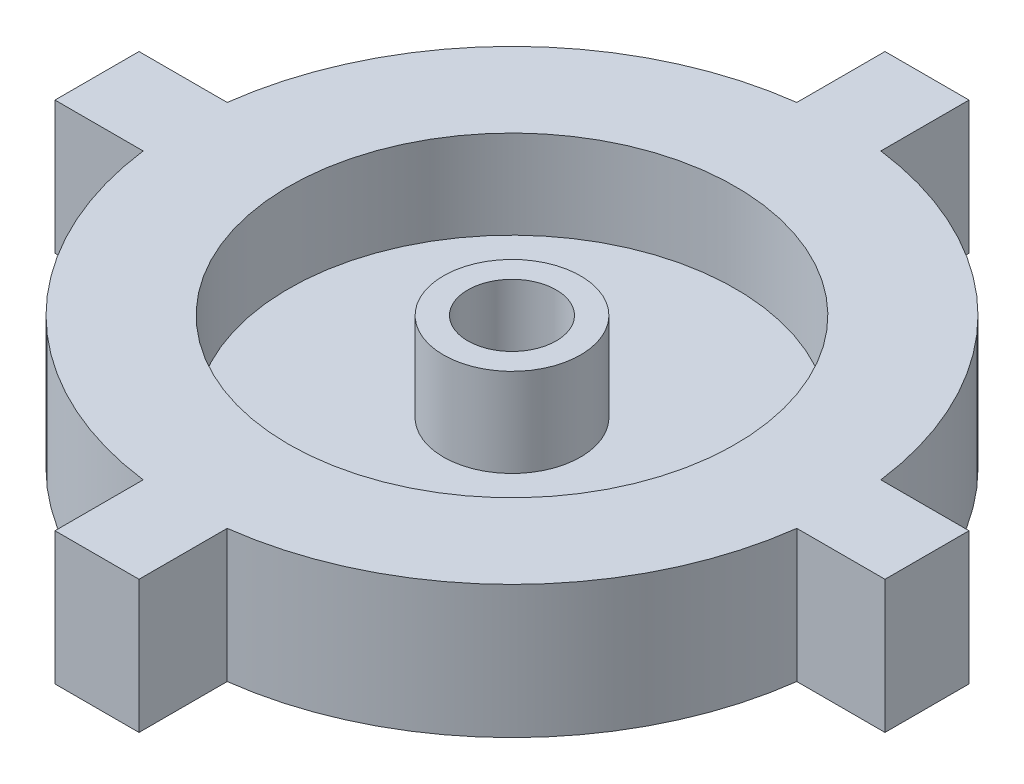
ISO-10303-21;
HEADER;
FILE_DESCRIPTION(('STEP AP214'),'2;1');
FILE_NAME('part.step','',(''),(''),'','','');
FILE_SCHEMA(('AUTOMOTIVE_DESIGN { 1 0 10303 214 1 1 1 1 }'));
ENDSEC;
DATA;
#1=APPLICATION_CONTEXT('core data for automotive mechanical design processes');
#2=APPLICATION_PROTOCOL_DEFINITION('international standard','automotive_design',2000,#1);
#3=PRODUCT_CONTEXT('',#1,'mechanical');
#4=PRODUCT('Part','Part','',(#3));
#5=PRODUCT_RELATED_PRODUCT_CATEGORY('part','',(#4));
#6=PRODUCT_DEFINITION_FORMATION('','',#4);
#7=PRODUCT_DEFINITION_CONTEXT('part definition',#1,'design');
#8=PRODUCT_DEFINITION('design','',#6,#7);
#9=PRODUCT_DEFINITION_SHAPE('','',#8);
#10=(LENGTH_UNIT() NAMED_UNIT(*) SI_UNIT(.MILLI.,.METRE.));
#11=(NAMED_UNIT(*) PLANE_ANGLE_UNIT() SI_UNIT($,.RADIAN.));
#12=(NAMED_UNIT(*) SI_UNIT($,.STERADIAN.) SOLID_ANGLE_UNIT());
#13=UNCERTAINTY_MEASURE_WITH_UNIT(LENGTH_MEASURE(1.E-05),#10,'distance_accuracy_value','');
#14=(GEOMETRIC_REPRESENTATION_CONTEXT(3) GLOBAL_UNCERTAINTY_ASSIGNED_CONTEXT((#13)) GLOBAL_UNIT_ASSIGNED_CONTEXT((#10,
#11,#12)) REPRESENTATION_CONTEXT('',''));
#15=CARTESIAN_POINT('',(0.,0.,0.));
#16=DIRECTION('',(0.,0.,1.));
#17=DIRECTION('',(1.,0.,0.));
#18=AXIS2_PLACEMENT_3D('',#15,#16,#17);
#19=CARTESIAN_POINT('',(0.,7.5,0.));
#20=DIRECTION('',(0.,1.,0.));
#21=DIRECTION('',(0.,0.,1.));
#22=AXIS2_PLACEMENT_3D('',#19,#20,#21);
#23=PLANE('',#22);
#24=CARTESIAN_POINT('',(0.,7.5,0.));
#25=DIRECTION('',(0.,1.,0.));
#26=DIRECTION('',(0.,0.,1.));
#27=AXIS2_PLACEMENT_3D('',#24,#25,#26);
#28=CIRCLE('',#27,25.25);
#29=CARTESIAN_POINT('',(0.,7.5,25.25));
#30=VERTEX_POINT('',#29);
#31=EDGE_CURVE('E361',#30,#30,#28,.T.);
#32=ORIENTED_EDGE('',*,*,#31,.F.);
#33=EDGE_LOOP('',(#32));
#34=FACE_BOUND('',#33,.T.);
#35=DIRECTION('',(0.,0.,1.));
#36=VECTOR('',#35,1.);
#37=CARTESIAN_POINT('',(-4.75,7.5,0.));
#38=LINE('',#37,#36);
#39=CARTESIAN_POINT('',(-4.75,7.5,-46.9151718682963));
#40=VERTEX_POINT('',#39);
#41=CARTESIAN_POINT('',(-4.75,7.5,-36.9459064038223));
#42=VERTEX_POINT('',#41);
#43=EDGE_CURVE('E156',#40,#42,#38,.T.);
#44=ORIENTED_EDGE('',*,*,#43,.T.);
#45=CARTESIAN_POINT('',(0.,7.5,0.));
#46=DIRECTION('',(0.,1.,0.));
#47=DIRECTION('',(0.,0.,1.));
#48=AXIS2_PLACEMENT_3D('',#45,#46,#47);
#49=CIRCLE('',#48,37.25);
#50=CARTESIAN_POINT('',(-36.9459064038223,7.5,-4.74999999999999));
#51=VERTEX_POINT('',#50);
#52=EDGE_CURVE('E36',#42,#51,#49,.T.);
#53=ORIENTED_EDGE('',*,*,#52,.T.);
#54=DIRECTION('',(-1.,0.,0.));
#55=VECTOR('',#54,1.);
#56=CARTESIAN_POINT('',(0.,7.5,-4.75));
#57=LINE('',#56,#55);
#58=CARTESIAN_POINT('',(-46.9151718682963,7.5,-4.74999999999999));
#59=VERTEX_POINT('',#58);
#60=EDGE_CURVE('E145',#51,#59,#57,.T.);
#61=ORIENTED_EDGE('',*,*,#60,.T.);
#62=DIRECTION('',(0.,0.,1.));
#63=VECTOR('',#62,1.);
#64=CARTESIAN_POINT('',(-46.9151718682963,7.5,0.));
#65=LINE('',#64,#63);
#66=CARTESIAN_POINT('',(-46.9151718682963,7.5,4.75000000000001));
#67=VERTEX_POINT('',#66);
#68=EDGE_CURVE('E150',#59,#67,#65,.T.);
#69=ORIENTED_EDGE('',*,*,#68,.T.);
#70=DIRECTION('',(1.,0.,0.));
#71=VECTOR('',#70,1.);
#72=CARTESIAN_POINT('',(0.,7.5,4.75));
#73=LINE('',#72,#71);
#74=CARTESIAN_POINT('',(-36.9459064038223,7.5,4.75000000000001));
#75=VERTEX_POINT('',#74);
#76=EDGE_CURVE('E189',#67,#75,#73,.T.);
#77=ORIENTED_EDGE('',*,*,#76,.T.);
#78=CARTESIAN_POINT('',(0.,7.5,0.));
#79=DIRECTION('',(0.,1.,0.));
#80=DIRECTION('',(0.,0.,1.));
#81=AXIS2_PLACEMENT_3D('',#78,#79,#80);
#82=CIRCLE('',#81,37.25);
#83=CARTESIAN_POINT('',(-4.75,7.5,36.9459064038223));
#84=VERTEX_POINT('',#83);
#85=EDGE_CURVE('E188',#75,#84,#82,.T.);
#86=ORIENTED_EDGE('',*,*,#85,.T.);
#87=DIRECTION('',(0.,0.,1.));
#88=VECTOR('',#87,1.);
#89=CARTESIAN_POINT('',(-4.75,7.5,0.));
#90=LINE('',#89,#88);
#91=CARTESIAN_POINT('',(-4.74999999999999,7.5,46.9151718682963));
#92=VERTEX_POINT('',#91);
#93=EDGE_CURVE('E185',#84,#92,#90,.T.);
#94=ORIENTED_EDGE('',*,*,#93,.T.);
#95=DIRECTION('',(1.,0.,0.));
#96=VECTOR('',#95,1.);
#97=CARTESIAN_POINT('',(0.,7.5,46.9151718682963));
#98=LINE('',#97,#96);
#99=CARTESIAN_POINT('',(4.75000000000001,7.5,46.9151718682963));
#100=VERTEX_POINT('',#99);
#101=EDGE_CURVE('E182',#92,#100,#98,.T.);
#102=ORIENTED_EDGE('',*,*,#101,.T.);
#103=DIRECTION('',(0.,0.,-1.));
#104=VECTOR('',#103,1.);
#105=CARTESIAN_POINT('',(4.75,7.5,0.));
#106=LINE('',#105,#104);
#107=CARTESIAN_POINT('',(4.75,7.5,36.9459064038223));
#108=VERTEX_POINT('',#107);
#109=EDGE_CURVE('E179',#100,#108,#106,.T.);
#110=ORIENTED_EDGE('',*,*,#109,.T.);
#111=CARTESIAN_POINT('',(0.,7.5,0.));
#112=DIRECTION('',(0.,1.,0.));
#113=DIRECTION('',(0.,0.,1.));
#114=AXIS2_PLACEMENT_3D('',#111,#112,#113);
#115=CIRCLE('',#114,37.25);
#116=CARTESIAN_POINT('',(36.9459064038223,7.5,4.75));
#117=VERTEX_POINT('',#116);
#118=EDGE_CURVE('E178',#108,#117,#115,.T.);
#119=ORIENTED_EDGE('',*,*,#118,.T.);
#120=DIRECTION('',(1.,0.,0.));
#121=VECTOR('',#120,1.);
#122=CARTESIAN_POINT('',(0.,7.5,4.75));
#123=LINE('',#122,#121);
#124=CARTESIAN_POINT('',(46.9151718682963,7.5,4.75));
#125=VERTEX_POINT('',#124);
#126=EDGE_CURVE('E175',#117,#125,#123,.T.);
#127=ORIENTED_EDGE('',*,*,#126,.T.);
#128=DIRECTION('',(0.,0.,-1.));
#129=VECTOR('',#128,1.);
#130=CARTESIAN_POINT('',(46.9151718682963,7.5,0.));
#131=LINE('',#130,#129);
#132=CARTESIAN_POINT('',(46.9151718682963,7.5,-4.75));
#133=VERTEX_POINT('',#132);
#134=EDGE_CURVE('E172',#125,#133,#131,.T.);
#135=ORIENTED_EDGE('',*,*,#134,.T.);
#136=DIRECTION('',(-1.,0.,0.));
#137=VECTOR('',#136,1.);
#138=CARTESIAN_POINT('',(0.,7.5,-4.75));
#139=LINE('',#138,#137);
#140=CARTESIAN_POINT('',(36.9459064038223,7.5,-4.75));
#141=VERTEX_POINT('',#140);
#142=EDGE_CURVE('E169',#133,#141,#139,.T.);
#143=ORIENTED_EDGE('',*,*,#142,.T.);
#144=CARTESIAN_POINT('',(0.,7.5,0.));
#145=DIRECTION('',(0.,1.,0.));
#146=DIRECTION('',(0.,0.,1.));
#147=AXIS2_PLACEMENT_3D('',#144,#145,#146);
#148=CIRCLE('',#147,37.25);
#149=CARTESIAN_POINT('',(4.75,7.5,-36.9459064038223));
#150=VERTEX_POINT('',#149);
#151=EDGE_CURVE('E168',#141,#150,#148,.T.);
#152=ORIENTED_EDGE('',*,*,#151,.T.);
#153=DIRECTION('',(0.,0.,-1.));
#154=VECTOR('',#153,1.);
#155=CARTESIAN_POINT('',(4.75,7.5,0.));
#156=LINE('',#155,#154);
#157=CARTESIAN_POINT('',(4.75,7.5,-46.9151718682963));
#158=VERTEX_POINT('',#157);
#159=EDGE_CURVE('E165',#150,#158,#156,.T.);
#160=ORIENTED_EDGE('',*,*,#159,.T.);
#161=DIRECTION('',(-1.,0.,0.));
#162=VECTOR('',#161,1.);
#163=CARTESIAN_POINT('',(0.,7.5,-46.9151718682963));
#164=LINE('',#163,#162);
#165=EDGE_CURVE('E162',#158,#40,#164,.T.);
#166=ORIENTED_EDGE('',*,*,#165,.T.);
#167=EDGE_LOOP('',(#44,#53,#61,#69,#77,#86,#94,#102,#110,#119,#127,#135,#143,#152,#160,#166));
#168=FACE_BOUND('',#167,.T.);
#169=ADVANCED_FACE('F32',(#34,#168),#23,.T.);
#170=CARTESIAN_POINT('',(0.,-7.5,0.));
#171=DIRECTION('',(0.,1.,0.));
#172=DIRECTION('',(0.,0.,1.));
#173=AXIS2_PLACEMENT_3D('',#170,#171,#172);
#174=PLANE('',#173);
#175=CARTESIAN_POINT('',(0.,-7.5,0.));
#176=DIRECTION('',(0.,1.,0.));
#177=DIRECTION('',(0.,0.,1.));
#178=AXIS2_PLACEMENT_3D('',#175,#176,#177);
#179=CIRCLE('',#178,5.);
#180=CARTESIAN_POINT('',(0.,-7.5,5.));
#181=VERTEX_POINT('',#180);
#182=EDGE_CURVE('E164',#181,#181,#179,.T.);
#183=ORIENTED_EDGE('',*,*,#182,.T.);
#184=EDGE_LOOP('',(#183));
#185=FACE_BOUND('',#184,.T.);
#186=CARTESIAN_POINT('',(0.,-7.5,0.));
#187=DIRECTION('',(0.,1.,0.));
#188=DIRECTION('',(1.,0.,0.));
#189=AXIS2_PLACEMENT_3D('',#186,#187,#188);
#190=CIRCLE('',#189,37.25);
#191=CARTESIAN_POINT('',(-4.75,-7.5,-36.9459064038223));
#192=VERTEX_POINT('',#191);
#193=CARTESIAN_POINT('',(-36.9459064038223,-7.5,-4.74999999999999));
#194=VERTEX_POINT('',#193);
#195=EDGE_CURVE('E42',#192,#194,#190,.T.);
#196=ORIENTED_EDGE('',*,*,#195,.F.);
#197=DIRECTION('',(0.,0.,1.));
#198=VECTOR('',#197,1.);
#199=CARTESIAN_POINT('',(-4.75,-7.5,-37.1651718682963));
#200=LINE('',#199,#198);
#201=CARTESIAN_POINT('',(-4.75,-7.5,-46.9151718682963));
#202=VERTEX_POINT('',#201);
#203=EDGE_CURVE('E195',#202,#192,#200,.T.);
#204=ORIENTED_EDGE('',*,*,#203,.F.);
#205=DIRECTION('',(-1.,0.,0.));
#206=VECTOR('',#205,1.);
#207=CARTESIAN_POINT('',(-5.,-7.5,-46.9151718682963));
#208=LINE('',#207,#206);
#209=CARTESIAN_POINT('',(4.75,-7.5,-46.9151718682963));
#210=VERTEX_POINT('',#209);
#211=EDGE_CURVE('E246',#210,#202,#208,.T.);
#212=ORIENTED_EDGE('',*,*,#211,.F.);
#213=DIRECTION('',(0.,0.,-1.));
#214=VECTOR('',#213,1.);
#215=CARTESIAN_POINT('',(4.75,-7.5,-47.1651718682963));
#216=LINE('',#215,#214);
#217=CARTESIAN_POINT('',(4.75,-7.5,-36.9459064038223));
#218=VERTEX_POINT('',#217);
#219=EDGE_CURVE('E199',#218,#210,#216,.T.);
#220=ORIENTED_EDGE('',*,*,#219,.F.);
#221=CARTESIAN_POINT('',(0.,-7.5,0.));
#222=DIRECTION('',(0.,1.,0.));
#223=DIRECTION('',(1.,0.,0.));
#224=AXIS2_PLACEMENT_3D('',#221,#222,#223);
#225=CIRCLE('',#224,37.25);
#226=CARTESIAN_POINT('',(36.9459064038223,-7.5,-4.75));
#227=VERTEX_POINT('',#226);
#228=EDGE_CURVE('E200',#227,#218,#225,.T.);
#229=ORIENTED_EDGE('',*,*,#228,.F.);
#230=DIRECTION('',(-1.,0.,0.));
#231=VECTOR('',#230,1.);
#232=CARTESIAN_POINT('',(37.1651718682963,-7.5,-4.75));
#233=LINE('',#232,#231);
#234=CARTESIAN_POINT('',(46.9151718682963,-7.5,-4.75));
#235=VERTEX_POINT('',#234);
#236=EDGE_CURVE('E204',#235,#227,#233,.T.);
#237=ORIENTED_EDGE('',*,*,#236,.F.);
#238=DIRECTION('',(0.,0.,-1.));
#239=VECTOR('',#238,1.);
#240=CARTESIAN_POINT('',(46.9151718682963,-7.5,-5.));
#241=LINE('',#240,#239);
#242=CARTESIAN_POINT('',(46.9151718682963,-7.5,4.75));
#243=VERTEX_POINT('',#242);
#244=EDGE_CURVE('E239',#243,#235,#241,.T.);
#245=ORIENTED_EDGE('',*,*,#244,.F.);
#246=DIRECTION('',(1.,0.,0.));
#247=VECTOR('',#246,1.);
#248=CARTESIAN_POINT('',(47.1651718682963,-7.5,4.75));
#249=LINE('',#248,#247);
#250=CARTESIAN_POINT('',(36.9459064038223,-7.5,4.75));
#251=VERTEX_POINT('',#250);
#252=EDGE_CURVE('E208',#251,#243,#249,.T.);
#253=ORIENTED_EDGE('',*,*,#252,.F.);
#254=CARTESIAN_POINT('',(0.,-7.5,0.));
#255=DIRECTION('',(0.,1.,0.));
#256=DIRECTION('',(1.,0.,0.));
#257=AXIS2_PLACEMENT_3D('',#254,#255,#256);
#258=CIRCLE('',#257,37.25);
#259=CARTESIAN_POINT('',(4.75,-7.5,36.9459064038223));
#260=VERTEX_POINT('',#259);
#261=EDGE_CURVE('E209',#260,#251,#258,.T.);
#262=ORIENTED_EDGE('',*,*,#261,.F.);
#263=DIRECTION('',(0.,0.,-1.));
#264=VECTOR('',#263,1.);
#265=CARTESIAN_POINT('',(4.75,-7.5,37.1651718682963));
#266=LINE('',#265,#264);
#267=CARTESIAN_POINT('',(4.75000000000001,-7.5,46.9151718682963));
#268=VERTEX_POINT('',#267);
#269=EDGE_CURVE('E213',#268,#260,#266,.T.);
#270=ORIENTED_EDGE('',*,*,#269,.F.);
#271=DIRECTION('',(1.,0.,0.));
#272=VECTOR('',#271,1.);
#273=CARTESIAN_POINT('',(5.00000000000001,-7.5,46.9151718682963));
#274=LINE('',#273,#272);
#275=CARTESIAN_POINT('',(-4.74999999999999,-7.5,46.9151718682963));
#276=VERTEX_POINT('',#275);
#277=EDGE_CURVE('E232',#276,#268,#274,.T.);
#278=ORIENTED_EDGE('',*,*,#277,.F.);
#279=DIRECTION('',(0.,0.,1.));
#280=VECTOR('',#279,1.);
#281=CARTESIAN_POINT('',(-4.74999999999999,-7.5,47.1651718682963));
#282=LINE('',#281,#280);
#283=CARTESIAN_POINT('',(-4.75,-7.5,36.9459064038223));
#284=VERTEX_POINT('',#283);
#285=EDGE_CURVE('E217',#284,#276,#282,.T.);
#286=ORIENTED_EDGE('',*,*,#285,.F.);
#287=CARTESIAN_POINT('',(0.,-7.5,0.));
#288=DIRECTION('',(0.,1.,0.));
#289=DIRECTION('',(1.,0.,0.));
#290=AXIS2_PLACEMENT_3D('',#287,#288,#289);
#291=CIRCLE('',#290,37.25);
#292=CARTESIAN_POINT('',(-36.9459064038223,-7.5,4.75000000000001));
#293=VERTEX_POINT('',#292);
#294=EDGE_CURVE('E218',#293,#284,#291,.T.);
#295=ORIENTED_EDGE('',*,*,#294,.F.);
#296=DIRECTION('',(1.,0.,0.));
#297=VECTOR('',#296,1.);
#298=CARTESIAN_POINT('',(-37.1651718682963,-7.5,4.75000000000001));
#299=LINE('',#298,#297);
#300=CARTESIAN_POINT('',(-46.9151718682963,-7.5,4.75000000000001));
#301=VERTEX_POINT('',#300);
#302=EDGE_CURVE('E222',#301,#293,#299,.T.);
#303=ORIENTED_EDGE('',*,*,#302,.F.);
#304=DIRECTION('',(0.,0.,1.));
#305=VECTOR('',#304,1.);
#306=CARTESIAN_POINT('',(-46.9151718682963,-7.5,5.00000000000001));
#307=LINE('',#306,#305);
#308=CARTESIAN_POINT('',(-46.9151718682963,-7.5,-4.74999999999999));
#309=VERTEX_POINT('',#308);
#310=EDGE_CURVE('E224',#309,#301,#307,.T.);
#311=ORIENTED_EDGE('',*,*,#310,.F.);
#312=DIRECTION('',(-1.,0.,0.));
#313=VECTOR('',#312,1.);
#314=CARTESIAN_POINT('',(-47.1651718682963,-7.5,-4.74999999999999));
#315=LINE('',#314,#313);
#316=EDGE_CURVE('E225',#194,#309,#315,.T.);
#317=ORIENTED_EDGE('',*,*,#316,.F.);
#318=EDGE_LOOP('',(#196,#204,#212,#220,#229,#237,#245,#253,#262,#270,#278,#286,#295,#303,#311,#317));
#319=FACE_BOUND('',#318,.T.);
#320=ADVANCED_FACE('F34',(#185,#319),#174,.F.);
#321=CARTESIAN_POINT('',(0.,7.5,0.));
#322=DIRECTION('',(0.,1.,0.));
#323=DIRECTION('',(0.,0.,1.));
#324=AXIS2_PLACEMENT_3D('',#321,#322,#323);
#325=CIRCLE('',#324,5.);
#326=CARTESIAN_POINT('',(0.,7.5,5.));
#327=VERTEX_POINT('',#326);
#328=EDGE_CURVE('E356',#327,#327,#325,.T.);
#329=ORIENTED_EDGE('',*,*,#328,.F.);
#330=EDGE_LOOP('',(#329));
#331=FACE_BOUND('',#330,.T.);
#332=CARTESIAN_POINT('',(0.,7.5,0.));
#333=DIRECTION('',(0.,1.,0.));
#334=DIRECTION('',(0.,0.,1.));
#335=AXIS2_PLACEMENT_3D('',#332,#333,#334);
#336=CIRCLE('',#335,7.75);
#337=CARTESIAN_POINT('',(0.,7.5,7.75));
#338=VERTEX_POINT('',#337);
#339=EDGE_CURVE('E359',#338,#338,#336,.T.);
#340=ORIENTED_EDGE('',*,*,#339,.T.);
#341=EDGE_LOOP('',(#340));
#342=FACE_BOUND('',#341,.T.);
#343=ADVANCED_FACE('F337',(#331,#342),#23,.T.);
#344=CARTESIAN_POINT('',(0.,7.5,0.));
#345=DIRECTION('',(0.,-1.,0.));
#346=DIRECTION('',(0.,0.,-1.));
#347=AXIS2_PLACEMENT_3D('',#344,#345,#346);
#348=CYLINDRICAL_SURFACE('',#347,5.);
#349=ORIENTED_EDGE('',*,*,#328,.T.);
#350=EDGE_LOOP('',(#349));
#351=FACE_BOUND('',#350,.T.);
#352=ORIENTED_EDGE('',*,*,#182,.F.);
#353=EDGE_LOOP('',(#352));
#354=FACE_BOUND('',#353,.T.);
#355=ADVANCED_FACE('F345',(#351,#354),#348,.F.);
#356=CARTESIAN_POINT('',(0.,-2.5,0.));
#357=DIRECTION('',(0.,1.,0.));
#358=DIRECTION('',(0.,0.,1.));
#359=AXIS2_PLACEMENT_3D('',#356,#357,#358);
#360=CYLINDRICAL_SURFACE('',#359,25.25);
#361=CARTESIAN_POINT('',(0.,-2.5,0.));
#362=DIRECTION('',(0.,1.,0.));
#363=DIRECTION('',(0.,0.,1.));
#364=AXIS2_PLACEMENT_3D('',#361,#362,#363);
#365=CIRCLE('',#364,25.25);
#366=CARTESIAN_POINT('',(0.,-2.5,25.25));
#367=VERTEX_POINT('',#366);
#368=EDGE_CURVE('E366',#367,#367,#365,.T.);
#369=ORIENTED_EDGE('',*,*,#368,.F.);
#370=EDGE_LOOP('',(#369));
#371=FACE_BOUND('',#370,.T.);
#372=ORIENTED_EDGE('',*,*,#31,.T.);
#373=EDGE_LOOP('',(#372));
#374=FACE_BOUND('',#373,.T.);
#375=ADVANCED_FACE('F350',(#371,#374),#360,.F.);
#376=CARTESIAN_POINT('',(0.,-2.5,0.));
#377=DIRECTION('',(0.,1.,0.));
#378=DIRECTION('',(0.,0.,1.));
#379=AXIS2_PLACEMENT_3D('',#376,#377,#378);
#380=PLANE('',#379);
#381=CARTESIAN_POINT('',(0.,-2.5,0.));
#382=DIRECTION('',(0.,1.,0.));
#383=DIRECTION('',(0.,0.,1.));
#384=AXIS2_PLACEMENT_3D('',#381,#382,#383);
#385=CIRCLE('',#384,7.75);
#386=CARTESIAN_POINT('',(0.,-2.5,7.75));
#387=VERTEX_POINT('',#386);
#388=EDGE_CURVE('E160',#387,#387,#385,.T.);
#389=ORIENTED_EDGE('',*,*,#388,.F.);
#390=EDGE_LOOP('',(#389));
#391=FACE_BOUND('',#390,.T.);
#392=ORIENTED_EDGE('',*,*,#368,.T.);
#393=EDGE_LOOP('',(#392));
#394=FACE_BOUND('',#393,.T.);
#395=ADVANCED_FACE('F372',(#391,#394),#380,.T.);
#396=CARTESIAN_POINT('',(0.,-2.5,0.));
#397=DIRECTION('',(0.,1.,0.));
#398=DIRECTION('',(0.,0.,1.));
#399=AXIS2_PLACEMENT_3D('',#396,#397,#398);
#400=CYLINDRICAL_SURFACE('',#399,7.75);
#401=ORIENTED_EDGE('',*,*,#388,.T.);
#402=EDGE_LOOP('',(#401));
#403=FACE_BOUND('',#402,.T.);
#404=ORIENTED_EDGE('',*,*,#339,.F.);
#405=EDGE_LOOP('',(#404));
#406=FACE_BOUND('',#405,.T.);
#407=ADVANCED_FACE('F378',(#403,#406),#400,.T.);
#408=CARTESIAN_POINT('',(-47.1651718682963,-7.5,-4.74999999999999));
#409=DIRECTION('',(0.,0.,-1.));
#410=DIRECTION('',(-1.,0.,0.));
#411=AXIS2_PLACEMENT_3D('',#408,#409,#410);
#412=PLANE('',#411);
#413=DIRECTION('',(0.,1.,0.));
#414=VECTOR('',#413,1.);
#415=CARTESIAN_POINT('',(-36.9459064038223,-7.5,-4.74999999999999));
#416=LINE('',#415,#414);
#417=EDGE_CURVE('E11',#194,#51,#416,.T.);
#418=ORIENTED_EDGE('',*,*,#417,.F.);
#419=ORIENTED_EDGE('',*,*,#316,.T.);
#420=DIRECTION('',(0.,1.,0.));
#421=VECTOR('',#420,1.);
#422=CARTESIAN_POINT('',(-46.9151718682963,-7.5,-4.74999999999999));
#423=LINE('',#422,#421);
#424=EDGE_CURVE('E141',#309,#59,#423,.T.);
#425=ORIENTED_EDGE('',*,*,#424,.T.);
#426=ORIENTED_EDGE('',*,*,#60,.F.);
#427=EDGE_LOOP('',(#418,#419,#425,#426));
#428=FACE_BOUND('',#427,.T.);
#429=ADVANCED_FACE('F146',(#428),#412,.T.);
#430=CARTESIAN_POINT('',(-46.9151718682963,-7.5,5.00000000000001));
#431=DIRECTION('',(-1.,0.,0.));
#432=DIRECTION('',(0.,0.,1.));
#433=AXIS2_PLACEMENT_3D('',#430,#431,#432);
#434=PLANE('',#433);
#435=ORIENTED_EDGE('',*,*,#424,.F.);
#436=ORIENTED_EDGE('',*,*,#310,.T.);
#437=DIRECTION('',(0.,1.,0.));
#438=VECTOR('',#437,1.);
#439=CARTESIAN_POINT('',(-46.9151718682963,-7.5,4.75000000000001));
#440=LINE('',#439,#438);
#441=EDGE_CURVE('E226',#301,#67,#440,.T.);
#442=ORIENTED_EDGE('',*,*,#441,.T.);
#443=ORIENTED_EDGE('',*,*,#68,.F.);
#444=EDGE_LOOP('',(#435,#436,#442,#443));
#445=FACE_BOUND('',#444,.T.);
#446=ADVANCED_FACE('F305',(#445),#434,.T.);
#447=CARTESIAN_POINT('',(-37.1651718682963,-7.5,4.75000000000001));
#448=DIRECTION('',(0.,0.,1.));
#449=DIRECTION('',(1.,0.,0.));
#450=AXIS2_PLACEMENT_3D('',#447,#448,#449);
#451=PLANE('',#450);
#452=ORIENTED_EDGE('',*,*,#441,.F.);
#453=ORIENTED_EDGE('',*,*,#302,.T.);
#454=DIRECTION('',(0.,1.,0.));
#455=VECTOR('',#454,1.);
#456=CARTESIAN_POINT('',(-36.9459064038223,-7.5,4.75000000000001));
#457=LINE('',#456,#455);
#458=EDGE_CURVE('E219',#293,#75,#457,.T.);
#459=ORIENTED_EDGE('',*,*,#458,.T.);
#460=ORIENTED_EDGE('',*,*,#76,.F.);
#461=EDGE_LOOP('',(#452,#453,#459,#460));
#462=FACE_BOUND('',#461,.T.);
#463=ADVANCED_FACE('F307',(#462),#451,.T.);
#464=CARTESIAN_POINT('',(0.,-7.5,0.));
#465=DIRECTION('',(0.,1.,0.));
#466=DIRECTION('',(0.,0.,1.));
#467=AXIS2_PLACEMENT_3D('',#464,#465,#466);
#468=CYLINDRICAL_SURFACE('',#467,37.25);
#469=ORIENTED_EDGE('',*,*,#458,.F.);
#470=ORIENTED_EDGE('',*,*,#294,.T.);
#471=DIRECTION('',(0.,1.,0.));
#472=VECTOR('',#471,1.);
#473=CARTESIAN_POINT('',(-4.75,-7.5,36.9459064038223));
#474=LINE('',#473,#472);
#475=EDGE_CURVE('E214',#284,#84,#474,.T.);
#476=ORIENTED_EDGE('',*,*,#475,.T.);
#477=ORIENTED_EDGE('',*,*,#85,.F.);
#478=EDGE_LOOP('',(#469,#470,#476,#477));
#479=FACE_BOUND('',#478,.T.);
#480=ADVANCED_FACE('F309',(#479),#468,.T.);
#481=CARTESIAN_POINT('',(-4.74999999999999,-7.5,47.1651718682963));
#482=DIRECTION('',(-1.,0.,0.));
#483=DIRECTION('',(0.,0.,1.));
#484=AXIS2_PLACEMENT_3D('',#481,#482,#483);
#485=PLANE('',#484);
#486=ORIENTED_EDGE('',*,*,#475,.F.);
#487=ORIENTED_EDGE('',*,*,#285,.T.);
#488=DIRECTION('',(0.,1.,0.));
#489=VECTOR('',#488,1.);
#490=CARTESIAN_POINT('',(-4.74999999999999,-7.5,46.9151718682963));
#491=LINE('',#490,#489);
#492=EDGE_CURVE('E229',#276,#92,#491,.T.);
#493=ORIENTED_EDGE('',*,*,#492,.T.);
#494=ORIENTED_EDGE('',*,*,#93,.F.);
#495=EDGE_LOOP('',(#486,#487,#493,#494));
#496=FACE_BOUND('',#495,.T.);
#497=ADVANCED_FACE('F312',(#496),#485,.T.);
#498=CARTESIAN_POINT('',(5.00000000000001,-7.5,46.9151718682963));
#499=DIRECTION('',(0.,0.,1.));
#500=DIRECTION('',(1.,0.,0.));
#501=AXIS2_PLACEMENT_3D('',#498,#499,#500);
#502=PLANE('',#501);
#503=ORIENTED_EDGE('',*,*,#492,.F.);
#504=ORIENTED_EDGE('',*,*,#277,.T.);
#505=DIRECTION('',(0.,1.,0.));
#506=VECTOR('',#505,1.);
#507=CARTESIAN_POINT('',(4.75000000000001,-7.5,46.9151718682963));
#508=LINE('',#507,#506);
#509=EDGE_CURVE('E233',#268,#100,#508,.T.);
#510=ORIENTED_EDGE('',*,*,#509,.T.);
#511=ORIENTED_EDGE('',*,*,#101,.F.);
#512=EDGE_LOOP('',(#503,#504,#510,#511));
#513=FACE_BOUND('',#512,.T.);
#514=ADVANCED_FACE('F315',(#513),#502,.T.);
#515=CARTESIAN_POINT('',(4.75,-7.5,37.1651718682963));
#516=DIRECTION('',(1.,0.,0.));
#517=DIRECTION('',(0.,0.,-1.));
#518=AXIS2_PLACEMENT_3D('',#515,#516,#517);
#519=PLANE('',#518);
#520=ORIENTED_EDGE('',*,*,#509,.F.);
#521=ORIENTED_EDGE('',*,*,#269,.T.);
#522=DIRECTION('',(0.,1.,0.));
#523=VECTOR('',#522,1.);
#524=CARTESIAN_POINT('',(4.75,-7.5,36.9459064038223));
#525=LINE('',#524,#523);
#526=EDGE_CURVE('E210',#260,#108,#525,.T.);
#527=ORIENTED_EDGE('',*,*,#526,.T.);
#528=ORIENTED_EDGE('',*,*,#109,.F.);
#529=EDGE_LOOP('',(#520,#521,#527,#528));
#530=FACE_BOUND('',#529,.T.);
#531=ADVANCED_FACE('F318',(#530),#519,.T.);
#532=CARTESIAN_POINT('',(0.,-7.5,0.));
#533=DIRECTION('',(0.,1.,0.));
#534=DIRECTION('',(0.,0.,1.));
#535=AXIS2_PLACEMENT_3D('',#532,#533,#534);
#536=CYLINDRICAL_SURFACE('',#535,37.25);
#537=ORIENTED_EDGE('',*,*,#526,.F.);
#538=ORIENTED_EDGE('',*,*,#261,.T.);
#539=DIRECTION('',(0.,1.,0.));
#540=VECTOR('',#539,1.);
#541=CARTESIAN_POINT('',(36.9459064038223,-7.5,4.75));
#542=LINE('',#541,#540);
#543=EDGE_CURVE('E205',#251,#117,#542,.T.);
#544=ORIENTED_EDGE('',*,*,#543,.T.);
#545=ORIENTED_EDGE('',*,*,#118,.F.);
#546=EDGE_LOOP('',(#537,#538,#544,#545));
#547=FACE_BOUND('',#546,.T.);
#548=ADVANCED_FACE('F321',(#547),#536,.T.);
#549=CARTESIAN_POINT('',(47.1651718682963,-7.5,4.75));
#550=DIRECTION('',(0.,0.,1.));
#551=DIRECTION('',(1.,0.,0.));
#552=AXIS2_PLACEMENT_3D('',#549,#550,#551);
#553=PLANE('',#552);
#554=ORIENTED_EDGE('',*,*,#543,.F.);
#555=ORIENTED_EDGE('',*,*,#252,.T.);
#556=DIRECTION('',(0.,1.,0.));
#557=VECTOR('',#556,1.);
#558=CARTESIAN_POINT('',(46.9151718682963,-7.5,4.75));
#559=LINE('',#558,#557);
#560=EDGE_CURVE('E236',#243,#125,#559,.T.);
#561=ORIENTED_EDGE('',*,*,#560,.T.);
#562=ORIENTED_EDGE('',*,*,#126,.F.);
#563=EDGE_LOOP('',(#554,#555,#561,#562));
#564=FACE_BOUND('',#563,.T.);
#565=ADVANCED_FACE('F324',(#564),#553,.T.);
#566=CARTESIAN_POINT('',(46.9151718682963,-7.5,-5.));
#567=DIRECTION('',(1.,0.,0.));
#568=DIRECTION('',(0.,0.,-1.));
#569=AXIS2_PLACEMENT_3D('',#566,#567,#568);
#570=PLANE('',#569);
#571=ORIENTED_EDGE('',*,*,#560,.F.);
#572=ORIENTED_EDGE('',*,*,#244,.T.);
#573=DIRECTION('',(0.,1.,0.));
#574=VECTOR('',#573,1.);
#575=CARTESIAN_POINT('',(46.9151718682963,-7.5,-4.75));
#576=LINE('',#575,#574);
#577=EDGE_CURVE('E240',#235,#133,#576,.T.);
#578=ORIENTED_EDGE('',*,*,#577,.T.);
#579=ORIENTED_EDGE('',*,*,#134,.F.);
#580=EDGE_LOOP('',(#571,#572,#578,#579));
#581=FACE_BOUND('',#580,.T.);
#582=ADVANCED_FACE('F326',(#581),#570,.T.);
#583=CARTESIAN_POINT('',(37.1651718682963,-7.5,-4.75));
#584=DIRECTION('',(0.,0.,-1.));
#585=DIRECTION('',(-1.,0.,0.));
#586=AXIS2_PLACEMENT_3D('',#583,#584,#585);
#587=PLANE('',#586);
#588=ORIENTED_EDGE('',*,*,#577,.F.);
#589=ORIENTED_EDGE('',*,*,#236,.T.);
#590=DIRECTION('',(0.,1.,0.));
#591=VECTOR('',#590,1.);
#592=CARTESIAN_POINT('',(36.9459064038223,-7.5,-4.75));
#593=LINE('',#592,#591);
#594=EDGE_CURVE('E201',#227,#141,#593,.T.);
#595=ORIENTED_EDGE('',*,*,#594,.T.);
#596=ORIENTED_EDGE('',*,*,#142,.F.);
#597=EDGE_LOOP('',(#588,#589,#595,#596));
#598=FACE_BOUND('',#597,.T.);
#599=ADVANCED_FACE('F287',(#598),#587,.T.);
#600=CARTESIAN_POINT('',(0.,-7.5,0.));
#601=DIRECTION('',(0.,1.,0.));
#602=DIRECTION('',(0.,0.,1.));
#603=AXIS2_PLACEMENT_3D('',#600,#601,#602);
#604=CYLINDRICAL_SURFACE('',#603,37.25);
#605=ORIENTED_EDGE('',*,*,#594,.F.);
#606=ORIENTED_EDGE('',*,*,#228,.T.);
#607=DIRECTION('',(0.,1.,0.));
#608=VECTOR('',#607,1.);
#609=CARTESIAN_POINT('',(4.75,-7.5,-36.9459064038223));
#610=LINE('',#609,#608);
#611=EDGE_CURVE('E196',#218,#150,#610,.T.);
#612=ORIENTED_EDGE('',*,*,#611,.T.);
#613=ORIENTED_EDGE('',*,*,#151,.F.);
#614=EDGE_LOOP('',(#605,#606,#612,#613));
#615=FACE_BOUND('',#614,.T.);
#616=ADVANCED_FACE('F285',(#615),#604,.T.);
#617=CARTESIAN_POINT('',(4.75,-7.5,-47.1651718682963));
#618=DIRECTION('',(1.,0.,0.));
#619=DIRECTION('',(0.,0.,-1.));
#620=AXIS2_PLACEMENT_3D('',#617,#618,#619);
#621=PLANE('',#620);
#622=ORIENTED_EDGE('',*,*,#611,.F.);
#623=ORIENTED_EDGE('',*,*,#219,.T.);
#624=DIRECTION('',(0.,1.,0.));
#625=VECTOR('',#624,1.);
#626=CARTESIAN_POINT('',(4.75,-7.5,-46.9151718682963));
#627=LINE('',#626,#625);
#628=EDGE_CURVE('E243',#210,#158,#627,.T.);
#629=ORIENTED_EDGE('',*,*,#628,.T.);
#630=ORIENTED_EDGE('',*,*,#159,.F.);
#631=EDGE_LOOP('',(#622,#623,#629,#630));
#632=FACE_BOUND('',#631,.T.);
#633=ADVANCED_FACE('F296',(#632),#621,.T.);
#634=CARTESIAN_POINT('',(-5.,-7.5,-46.9151718682963));
#635=DIRECTION('',(0.,0.,-1.));
#636=DIRECTION('',(-1.,0.,0.));
#637=AXIS2_PLACEMENT_3D('',#634,#635,#636);
#638=PLANE('',#637);
#639=ORIENTED_EDGE('',*,*,#628,.F.);
#640=ORIENTED_EDGE('',*,*,#211,.T.);
#641=DIRECTION('',(0.,1.,0.));
#642=VECTOR('',#641,1.);
#643=CARTESIAN_POINT('',(-4.75,-7.5,-46.9151718682963));
#644=LINE('',#643,#642);
#645=EDGE_CURVE('E247',#202,#40,#644,.T.);
#646=ORIENTED_EDGE('',*,*,#645,.T.);
#647=ORIENTED_EDGE('',*,*,#165,.F.);
#648=EDGE_LOOP('',(#639,#640,#646,#647));
#649=FACE_BOUND('',#648,.T.);
#650=ADVANCED_FACE('F298',(#649),#638,.T.);
#651=CARTESIAN_POINT('',(-4.75,-7.5,-37.1651718682963));
#652=DIRECTION('',(-1.,0.,0.));
#653=DIRECTION('',(0.,0.,1.));
#654=AXIS2_PLACEMENT_3D('',#651,#652,#653);
#655=PLANE('',#654);
#656=ORIENTED_EDGE('',*,*,#645,.F.);
#657=ORIENTED_EDGE('',*,*,#203,.T.);
#658=DIRECTION('',(0.,1.,0.));
#659=VECTOR('',#658,1.);
#660=CARTESIAN_POINT('',(-4.75,-7.5,-36.9459064038223));
#661=LINE('',#660,#659);
#662=EDGE_CURVE('E193',#192,#42,#661,.T.);
#663=ORIENTED_EDGE('',*,*,#662,.T.);
#664=ORIENTED_EDGE('',*,*,#43,.F.);
#665=EDGE_LOOP('',(#656,#657,#663,#664));
#666=FACE_BOUND('',#665,.T.);
#667=ADVANCED_FACE('F300',(#666),#655,.T.);
#668=CARTESIAN_POINT('',(0.,-7.5,0.));
#669=DIRECTION('',(0.,1.,0.));
#670=DIRECTION('',(0.,0.,1.));
#671=AXIS2_PLACEMENT_3D('',#668,#669,#670);
#672=CYLINDRICAL_SURFACE('',#671,37.25);
#673=ORIENTED_EDGE('',*,*,#662,.F.);
#674=ORIENTED_EDGE('',*,*,#195,.T.);
#675=ORIENTED_EDGE('',*,*,#417,.T.);
#676=ORIENTED_EDGE('',*,*,#52,.F.);
#677=EDGE_LOOP('',(#673,#674,#675,#676));
#678=FACE_BOUND('',#677,.T.);
#679=ADVANCED_FACE('F152',(#678),#672,.T.);
#680=CLOSED_SHELL('',(#169,#320,#343,#355,#375,#395,#407,#429,#446,#463,#480,#497,#514,#531,
#548,#565,#582,#599,#616,#633,#650,#667,#679));
#681=MANIFOLD_SOLID_BREP('B2',#680);
#682=ADVANCED_BREP_SHAPE_REPRESENTATION('',(#18,#681),#14);
#683=SHAPE_DEFINITION_REPRESENTATION(#9,#682);
ENDSEC;
END-ISO-10303-21;
